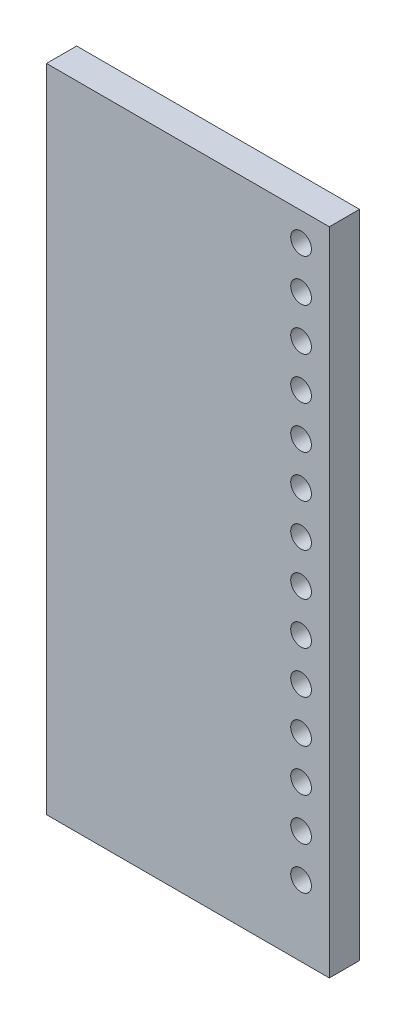
ISO-10303-21;
HEADER;
FILE_DESCRIPTION(('STEP AP214'),'2;1');
FILE_NAME('part.step','',(''),(''),'','','');
FILE_SCHEMA(('AUTOMOTIVE_DESIGN { 1 0 10303 214 1 1 1 1 }'));
ENDSEC;
DATA;
#1=APPLICATION_CONTEXT('core data for automotive mechanical design processes');
#2=APPLICATION_PROTOCOL_DEFINITION('international standard','automotive_design',2000,#1);
#3=PRODUCT_CONTEXT('',#1,'mechanical');
#4=PRODUCT('Part','Part','',(#3));
#5=PRODUCT_RELATED_PRODUCT_CATEGORY('part','',(#4));
#6=PRODUCT_DEFINITION_FORMATION('','',#4);
#7=PRODUCT_DEFINITION_CONTEXT('part definition',#1,'design');
#8=PRODUCT_DEFINITION('design','',#6,#7);
#9=PRODUCT_DEFINITION_SHAPE('','',#8);
#10=(LENGTH_UNIT() NAMED_UNIT(*) SI_UNIT(.MILLI.,.METRE.));
#11=(NAMED_UNIT(*) PLANE_ANGLE_UNIT() SI_UNIT($,.RADIAN.));
#12=(NAMED_UNIT(*) SI_UNIT($,.STERADIAN.) SOLID_ANGLE_UNIT());
#13=UNCERTAINTY_MEASURE_WITH_UNIT(LENGTH_MEASURE(1.E-05),#10,'distance_accuracy_value','');
#14=(GEOMETRIC_REPRESENTATION_CONTEXT(3) GLOBAL_UNCERTAINTY_ASSIGNED_CONTEXT((#13)) GLOBAL_UNIT_ASSIGNED_CONTEXT((#10,
#11,#12)) REPRESENTATION_CONTEXT('',''));
#15=CARTESIAN_POINT('',(0.,0.,0.));
#16=DIRECTION('',(0.,0.,1.));
#17=DIRECTION('',(1.,0.,0.));
#18=AXIS2_PLACEMENT_3D('',#15,#16,#17);
#19=CARTESIAN_POINT('',(60.,330.,0.));
#20=DIRECTION('',(0.,0.,1.));
#21=DIRECTION('',(1.,0.,0.));
#22=AXIS2_PLACEMENT_3D('',#19,#20,#21);
#23=CYLINDRICAL_SURFACE('',#22,5.5);
#24=CARTESIAN_POINT('',(60.,330.,0.));
#25=DIRECTION('',(0.,0.,1.));
#26=DIRECTION('',(1.,0.,0.));
#27=AXIS2_PLACEMENT_3D('',#24,#25,#26);
#28=CIRCLE('',#27,5.5);
#29=CARTESIAN_POINT('',(65.5,330.,0.));
#30=VERTEX_POINT('',#29);
#31=EDGE_CURVE('E55',#30,#30,#28,.T.);
#32=ORIENTED_EDGE('',*,*,#31,.F.);
#33=EDGE_LOOP('',(#32));
#34=FACE_BOUND('',#33,.T.);
#35=CARTESIAN_POINT('',(60.,330.,16.));
#36=DIRECTION('',(0.,0.,1.));
#37=DIRECTION('',(1.,0.,0.));
#38=AXIS2_PLACEMENT_3D('',#35,#36,#37);
#39=CIRCLE('',#38,5.5);
#40=CARTESIAN_POINT('',(65.5,330.,16.));
#41=VERTEX_POINT('',#40);
#42=EDGE_CURVE('E11',#41,#41,#39,.T.);
#43=ORIENTED_EDGE('',*,*,#42,.T.);
#44=EDGE_LOOP('',(#43));
#45=FACE_BOUND('',#44,.T.);
#46=ADVANCED_FACE('F47',(#34,#45),#23,.F.);
#47=CARTESIAN_POINT('',(60.,307.5,0.));
#48=DIRECTION('',(0.,0.,1.));
#49=DIRECTION('',(1.,0.,0.));
#50=AXIS2_PLACEMENT_3D('',#47,#48,#49);
#51=CYLINDRICAL_SURFACE('',#50,5.5);
#52=CARTESIAN_POINT('',(60.,307.5,0.));
#53=DIRECTION('',(0.,0.,1.));
#54=DIRECTION('',(1.,0.,0.));
#55=AXIS2_PLACEMENT_3D('',#52,#53,#54);
#56=CIRCLE('',#55,5.5);
#57=CARTESIAN_POINT('',(65.5,307.5,0.));
#58=VERTEX_POINT('',#57);
#59=EDGE_CURVE('E225',#58,#58,#56,.T.);
#60=ORIENTED_EDGE('',*,*,#59,.F.);
#61=EDGE_LOOP('',(#60));
#62=FACE_BOUND('',#61,.T.);
#63=CARTESIAN_POINT('',(60.,307.5,16.));
#64=DIRECTION('',(0.,0.,1.));
#65=DIRECTION('',(1.,0.,0.));
#66=AXIS2_PLACEMENT_3D('',#63,#64,#65);
#67=CIRCLE('',#66,5.5);
#68=CARTESIAN_POINT('',(65.5,307.5,16.));
#69=VERTEX_POINT('',#68);
#70=EDGE_CURVE('E228',#69,#69,#67,.T.);
#71=ORIENTED_EDGE('',*,*,#70,.T.);
#72=EDGE_LOOP('',(#71));
#73=FACE_BOUND('',#72,.T.);
#74=ADVANCED_FACE('F237',(#62,#73),#51,.F.);
#75=CARTESIAN_POINT('',(60.,285.,0.));
#76=DIRECTION('',(0.,0.,1.));
#77=DIRECTION('',(1.,0.,0.));
#78=AXIS2_PLACEMENT_3D('',#75,#76,#77);
#79=CYLINDRICAL_SURFACE('',#78,5.5);
#80=CARTESIAN_POINT('',(60.,285.,0.));
#81=DIRECTION('',(0.,0.,1.));
#82=DIRECTION('',(1.,0.,0.));
#83=AXIS2_PLACEMENT_3D('',#80,#81,#82);
#84=CIRCLE('',#83,5.5);
#85=CARTESIAN_POINT('',(65.5,285.,0.));
#86=VERTEX_POINT('',#85);
#87=EDGE_CURVE('E219',#86,#86,#84,.T.);
#88=ORIENTED_EDGE('',*,*,#87,.F.);
#89=EDGE_LOOP('',(#88));
#90=FACE_BOUND('',#89,.T.);
#91=CARTESIAN_POINT('',(60.,285.,16.));
#92=DIRECTION('',(0.,0.,1.));
#93=DIRECTION('',(1.,0.,0.));
#94=AXIS2_PLACEMENT_3D('',#91,#92,#93);
#95=CIRCLE('',#94,5.5);
#96=CARTESIAN_POINT('',(65.5,285.,16.));
#97=VERTEX_POINT('',#96);
#98=EDGE_CURVE('E222',#97,#97,#95,.T.);
#99=ORIENTED_EDGE('',*,*,#98,.T.);
#100=EDGE_LOOP('',(#99));
#101=FACE_BOUND('',#100,.T.);
#102=ADVANCED_FACE('F304',(#90,#101),#79,.F.);
#103=CARTESIAN_POINT('',(60.,262.5,0.));
#104=DIRECTION('',(0.,0.,1.));
#105=DIRECTION('',(1.,0.,0.));
#106=AXIS2_PLACEMENT_3D('',#103,#104,#105);
#107=CYLINDRICAL_SURFACE('',#106,5.5);
#108=CARTESIAN_POINT('',(60.,262.5,0.));
#109=DIRECTION('',(0.,0.,1.));
#110=DIRECTION('',(1.,0.,0.));
#111=AXIS2_PLACEMENT_3D('',#108,#109,#110);
#112=CIRCLE('',#111,5.5);
#113=CARTESIAN_POINT('',(65.5,262.5,0.));
#114=VERTEX_POINT('',#113);
#115=EDGE_CURVE('E213',#114,#114,#112,.T.);
#116=ORIENTED_EDGE('',*,*,#115,.F.);
#117=EDGE_LOOP('',(#116));
#118=FACE_BOUND('',#117,.T.);
#119=CARTESIAN_POINT('',(60.,262.5,16.));
#120=DIRECTION('',(0.,0.,1.));
#121=DIRECTION('',(1.,0.,0.));
#122=AXIS2_PLACEMENT_3D('',#119,#120,#121);
#123=CIRCLE('',#122,5.5);
#124=CARTESIAN_POINT('',(65.5,262.5,16.));
#125=VERTEX_POINT('',#124);
#126=EDGE_CURVE('E216',#125,#125,#123,.T.);
#127=ORIENTED_EDGE('',*,*,#126,.T.);
#128=EDGE_LOOP('',(#127));
#129=FACE_BOUND('',#128,.T.);
#130=ADVANCED_FACE('F300',(#118,#129),#107,.F.);
#131=CARTESIAN_POINT('',(60.,240.,0.));
#132=DIRECTION('',(0.,0.,1.));
#133=DIRECTION('',(1.,0.,0.));
#134=AXIS2_PLACEMENT_3D('',#131,#132,#133);
#135=CYLINDRICAL_SURFACE('',#134,5.5);
#136=CARTESIAN_POINT('',(60.,240.,0.));
#137=DIRECTION('',(0.,0.,1.));
#138=DIRECTION('',(1.,0.,0.));
#139=AXIS2_PLACEMENT_3D('',#136,#137,#138);
#140=CIRCLE('',#139,5.5);
#141=CARTESIAN_POINT('',(65.5,240.,0.));
#142=VERTEX_POINT('',#141);
#143=EDGE_CURVE('E207',#142,#142,#140,.T.);
#144=ORIENTED_EDGE('',*,*,#143,.F.);
#145=EDGE_LOOP('',(#144));
#146=FACE_BOUND('',#145,.T.);
#147=CARTESIAN_POINT('',(60.,240.,16.));
#148=DIRECTION('',(0.,0.,1.));
#149=DIRECTION('',(1.,0.,0.));
#150=AXIS2_PLACEMENT_3D('',#147,#148,#149);
#151=CIRCLE('',#150,5.5);
#152=CARTESIAN_POINT('',(65.5,240.,16.));
#153=VERTEX_POINT('',#152);
#154=EDGE_CURVE('E210',#153,#153,#151,.T.);
#155=ORIENTED_EDGE('',*,*,#154,.T.);
#156=EDGE_LOOP('',(#155));
#157=FACE_BOUND('',#156,.T.);
#158=ADVANCED_FACE('F296',(#146,#157),#135,.F.);
#159=CARTESIAN_POINT('',(60.,217.5,0.));
#160=DIRECTION('',(0.,0.,1.));
#161=DIRECTION('',(1.,0.,0.));
#162=AXIS2_PLACEMENT_3D('',#159,#160,#161);
#163=CYLINDRICAL_SURFACE('',#162,5.5);
#164=CARTESIAN_POINT('',(60.,217.5,0.));
#165=DIRECTION('',(0.,0.,1.));
#166=DIRECTION('',(1.,0.,0.));
#167=AXIS2_PLACEMENT_3D('',#164,#165,#166);
#168=CIRCLE('',#167,5.5);
#169=CARTESIAN_POINT('',(65.5,217.5,0.));
#170=VERTEX_POINT('',#169);
#171=EDGE_CURVE('E201',#170,#170,#168,.T.);
#172=ORIENTED_EDGE('',*,*,#171,.F.);
#173=EDGE_LOOP('',(#172));
#174=FACE_BOUND('',#173,.T.);
#175=CARTESIAN_POINT('',(60.,217.5,16.));
#176=DIRECTION('',(0.,0.,1.));
#177=DIRECTION('',(1.,0.,0.));
#178=AXIS2_PLACEMENT_3D('',#175,#176,#177);
#179=CIRCLE('',#178,5.5);
#180=CARTESIAN_POINT('',(65.5,217.5,16.));
#181=VERTEX_POINT('',#180);
#182=EDGE_CURVE('E204',#181,#181,#179,.T.);
#183=ORIENTED_EDGE('',*,*,#182,.T.);
#184=EDGE_LOOP('',(#183));
#185=FACE_BOUND('',#184,.T.);
#186=ADVANCED_FACE('F292',(#174,#185),#163,.F.);
#187=CARTESIAN_POINT('',(60.,195.,0.));
#188=DIRECTION('',(0.,0.,1.));
#189=DIRECTION('',(1.,0.,0.));
#190=AXIS2_PLACEMENT_3D('',#187,#188,#189);
#191=CYLINDRICAL_SURFACE('',#190,5.5);
#192=CARTESIAN_POINT('',(60.,195.,0.));
#193=DIRECTION('',(0.,0.,1.));
#194=DIRECTION('',(1.,0.,0.));
#195=AXIS2_PLACEMENT_3D('',#192,#193,#194);
#196=CIRCLE('',#195,5.5);
#197=CARTESIAN_POINT('',(65.5,195.,0.));
#198=VERTEX_POINT('',#197);
#199=EDGE_CURVE('E195',#198,#198,#196,.T.);
#200=ORIENTED_EDGE('',*,*,#199,.F.);
#201=EDGE_LOOP('',(#200));
#202=FACE_BOUND('',#201,.T.);
#203=CARTESIAN_POINT('',(60.,195.,16.));
#204=DIRECTION('',(0.,0.,1.));
#205=DIRECTION('',(1.,0.,0.));
#206=AXIS2_PLACEMENT_3D('',#203,#204,#205);
#207=CIRCLE('',#206,5.5);
#208=CARTESIAN_POINT('',(65.5,195.,16.));
#209=VERTEX_POINT('',#208);
#210=EDGE_CURVE('E198',#209,#209,#207,.T.);
#211=ORIENTED_EDGE('',*,*,#210,.T.);
#212=EDGE_LOOP('',(#211));
#213=FACE_BOUND('',#212,.T.);
#214=ADVANCED_FACE('F288',(#202,#213),#191,.F.);
#215=CARTESIAN_POINT('',(60.,172.5,0.));
#216=DIRECTION('',(0.,0.,1.));
#217=DIRECTION('',(1.,0.,0.));
#218=AXIS2_PLACEMENT_3D('',#215,#216,#217);
#219=CYLINDRICAL_SURFACE('',#218,5.5);
#220=CARTESIAN_POINT('',(60.,172.5,0.));
#221=DIRECTION('',(0.,0.,1.));
#222=DIRECTION('',(1.,0.,0.));
#223=AXIS2_PLACEMENT_3D('',#220,#221,#222);
#224=CIRCLE('',#223,5.5);
#225=CARTESIAN_POINT('',(65.5,172.5,0.));
#226=VERTEX_POINT('',#225);
#227=EDGE_CURVE('E189',#226,#226,#224,.T.);
#228=ORIENTED_EDGE('',*,*,#227,.F.);
#229=EDGE_LOOP('',(#228));
#230=FACE_BOUND('',#229,.T.);
#231=CARTESIAN_POINT('',(60.,172.5,16.));
#232=DIRECTION('',(0.,0.,1.));
#233=DIRECTION('',(1.,0.,0.));
#234=AXIS2_PLACEMENT_3D('',#231,#232,#233);
#235=CIRCLE('',#234,5.5);
#236=CARTESIAN_POINT('',(65.5,172.5,16.));
#237=VERTEX_POINT('',#236);
#238=EDGE_CURVE('E192',#237,#237,#235,.T.);
#239=ORIENTED_EDGE('',*,*,#238,.T.);
#240=EDGE_LOOP('',(#239));
#241=FACE_BOUND('',#240,.T.);
#242=ADVANCED_FACE('F284',(#230,#241),#219,.F.);
#243=CARTESIAN_POINT('',(60.,150.,0.));
#244=DIRECTION('',(0.,0.,1.));
#245=DIRECTION('',(1.,0.,0.));
#246=AXIS2_PLACEMENT_3D('',#243,#244,#245);
#247=CYLINDRICAL_SURFACE('',#246,5.5);
#248=CARTESIAN_POINT('',(60.,150.,0.));
#249=DIRECTION('',(0.,0.,1.));
#250=DIRECTION('',(1.,0.,0.));
#251=AXIS2_PLACEMENT_3D('',#248,#249,#250);
#252=CIRCLE('',#251,5.5);
#253=CARTESIAN_POINT('',(65.5,150.,0.));
#254=VERTEX_POINT('',#253);
#255=EDGE_CURVE('E183',#254,#254,#252,.T.);
#256=ORIENTED_EDGE('',*,*,#255,.F.);
#257=EDGE_LOOP('',(#256));
#258=FACE_BOUND('',#257,.T.);
#259=CARTESIAN_POINT('',(60.,150.,16.));
#260=DIRECTION('',(0.,0.,1.));
#261=DIRECTION('',(1.,0.,0.));
#262=AXIS2_PLACEMENT_3D('',#259,#260,#261);
#263=CIRCLE('',#262,5.5);
#264=CARTESIAN_POINT('',(65.5,150.,16.));
#265=VERTEX_POINT('',#264);
#266=EDGE_CURVE('E186',#265,#265,#263,.T.);
#267=ORIENTED_EDGE('',*,*,#266,.T.);
#268=EDGE_LOOP('',(#267));
#269=FACE_BOUND('',#268,.T.);
#270=ADVANCED_FACE('F280',(#258,#269),#247,.F.);
#271=CARTESIAN_POINT('',(60.,127.5,0.));
#272=DIRECTION('',(0.,0.,1.));
#273=DIRECTION('',(1.,0.,0.));
#274=AXIS2_PLACEMENT_3D('',#271,#272,#273);
#275=CYLINDRICAL_SURFACE('',#274,5.5);
#276=CARTESIAN_POINT('',(60.,127.5,0.));
#277=DIRECTION('',(0.,0.,1.));
#278=DIRECTION('',(1.,0.,0.));
#279=AXIS2_PLACEMENT_3D('',#276,#277,#278);
#280=CIRCLE('',#279,5.5);
#281=CARTESIAN_POINT('',(65.5,127.5,0.));
#282=VERTEX_POINT('',#281);
#283=EDGE_CURVE('E177',#282,#282,#280,.T.);
#284=ORIENTED_EDGE('',*,*,#283,.F.);
#285=EDGE_LOOP('',(#284));
#286=FACE_BOUND('',#285,.T.);
#287=CARTESIAN_POINT('',(60.,127.5,16.));
#288=DIRECTION('',(0.,0.,1.));
#289=DIRECTION('',(1.,0.,0.));
#290=AXIS2_PLACEMENT_3D('',#287,#288,#289);
#291=CIRCLE('',#290,5.5);
#292=CARTESIAN_POINT('',(65.5,127.5,16.));
#293=VERTEX_POINT('',#292);
#294=EDGE_CURVE('E180',#293,#293,#291,.T.);
#295=ORIENTED_EDGE('',*,*,#294,.T.);
#296=EDGE_LOOP('',(#295));
#297=FACE_BOUND('',#296,.T.);
#298=ADVANCED_FACE('F276',(#286,#297),#275,.F.);
#299=CARTESIAN_POINT('',(60.,105.,0.));
#300=DIRECTION('',(0.,0.,1.));
#301=DIRECTION('',(1.,0.,0.));
#302=AXIS2_PLACEMENT_3D('',#299,#300,#301);
#303=CYLINDRICAL_SURFACE('',#302,5.5);
#304=CARTESIAN_POINT('',(60.,105.,0.));
#305=DIRECTION('',(0.,0.,1.));
#306=DIRECTION('',(1.,0.,0.));
#307=AXIS2_PLACEMENT_3D('',#304,#305,#306);
#308=CIRCLE('',#307,5.5);
#309=CARTESIAN_POINT('',(65.5,105.,0.));
#310=VERTEX_POINT('',#309);
#311=EDGE_CURVE('E171',#310,#310,#308,.T.);
#312=ORIENTED_EDGE('',*,*,#311,.F.);
#313=EDGE_LOOP('',(#312));
#314=FACE_BOUND('',#313,.T.);
#315=CARTESIAN_POINT('',(60.,105.,16.));
#316=DIRECTION('',(0.,0.,1.));
#317=DIRECTION('',(1.,0.,0.));
#318=AXIS2_PLACEMENT_3D('',#315,#316,#317);
#319=CIRCLE('',#318,5.5);
#320=CARTESIAN_POINT('',(65.5,105.,16.));
#321=VERTEX_POINT('',#320);
#322=EDGE_CURVE('E174',#321,#321,#319,.T.);
#323=ORIENTED_EDGE('',*,*,#322,.T.);
#324=EDGE_LOOP('',(#323));
#325=FACE_BOUND('',#324,.T.);
#326=ADVANCED_FACE('F272',(#314,#325),#303,.F.);
#327=CARTESIAN_POINT('',(60.,82.5,0.));
#328=DIRECTION('',(0.,0.,1.));
#329=DIRECTION('',(1.,0.,0.));
#330=AXIS2_PLACEMENT_3D('',#327,#328,#329);
#331=CYLINDRICAL_SURFACE('',#330,5.5);
#332=CARTESIAN_POINT('',(60.,82.5,0.));
#333=DIRECTION('',(0.,0.,1.));
#334=DIRECTION('',(1.,0.,0.));
#335=AXIS2_PLACEMENT_3D('',#332,#333,#334);
#336=CIRCLE('',#335,5.5);
#337=CARTESIAN_POINT('',(65.5,82.5,0.));
#338=VERTEX_POINT('',#337);
#339=EDGE_CURVE('E165',#338,#338,#336,.T.);
#340=ORIENTED_EDGE('',*,*,#339,.F.);
#341=EDGE_LOOP('',(#340));
#342=FACE_BOUND('',#341,.T.);
#343=CARTESIAN_POINT('',(60.,82.5,16.));
#344=DIRECTION('',(0.,0.,1.));
#345=DIRECTION('',(1.,0.,0.));
#346=AXIS2_PLACEMENT_3D('',#343,#344,#345);
#347=CIRCLE('',#346,5.5);
#348=CARTESIAN_POINT('',(65.5,82.5,16.));
#349=VERTEX_POINT('',#348);
#350=EDGE_CURVE('E168',#349,#349,#347,.T.);
#351=ORIENTED_EDGE('',*,*,#350,.T.);
#352=EDGE_LOOP('',(#351));
#353=FACE_BOUND('',#352,.T.);
#354=ADVANCED_FACE('F269',(#342,#353),#331,.F.);
#355=CARTESIAN_POINT('',(-75.,0.,16.));
#356=DIRECTION('',(1.,0.,0.));
#357=DIRECTION('',(0.,1.,0.));
#358=AXIS2_PLACEMENT_3D('',#355,#356,#357);
#359=PLANE('',#358);
#360=DIRECTION('',(0.,-1.,0.));
#361=VECTOR('',#360,1.);
#362=CARTESIAN_POINT('',(-75.,0.,0.));
#363=LINE('',#362,#361);
#364=CARTESIAN_POINT('',(-75.0000000000001,345.,0.));
#365=VERTEX_POINT('',#364);
#366=CARTESIAN_POINT('',(-75.,0.,0.));
#367=VERTEX_POINT('',#366);
#368=EDGE_CURVE('E142',#365,#367,#363,.T.);
#369=ORIENTED_EDGE('',*,*,#368,.T.);
#370=DIRECTION('',(0.,0.,-1.));
#371=VECTOR('',#370,1.);
#372=CARTESIAN_POINT('',(-75.,0.,16.));
#373=LINE('',#372,#371);
#374=CARTESIAN_POINT('',(-75.,0.,16.));
#375=VERTEX_POINT('',#374);
#376=EDGE_CURVE('E163',#375,#367,#373,.T.);
#377=ORIENTED_EDGE('',*,*,#376,.F.);
#378=DIRECTION('',(0.,-1.,0.));
#379=VECTOR('',#378,1.);
#380=CARTESIAN_POINT('',(-75.,0.,16.));
#381=LINE('',#380,#379);
#382=CARTESIAN_POINT('',(-75.0000000000001,345.,16.));
#383=VERTEX_POINT('',#382);
#384=EDGE_CURVE('E145',#383,#375,#381,.T.);
#385=ORIENTED_EDGE('',*,*,#384,.F.);
#386=DIRECTION('',(0.,0.,-1.));
#387=VECTOR('',#386,1.);
#388=CARTESIAN_POINT('',(-75.0000000000001,345.,16.));
#389=LINE('',#388,#387);
#390=EDGE_CURVE('E151',#383,#365,#389,.T.);
#391=ORIENTED_EDGE('',*,*,#390,.T.);
#392=EDGE_LOOP('',(#369,#377,#385,#391));
#393=FACE_BOUND('',#392,.T.);
#394=ADVANCED_FACE('F265',(#393),#359,.F.);
#395=CARTESIAN_POINT('',(-75.,0.,16.));
#396=DIRECTION('',(0.,1.,0.));
#397=DIRECTION('',(-1.,0.,0.));
#398=AXIS2_PLACEMENT_3D('',#395,#396,#397);
#399=PLANE('',#398);
#400=CARTESIAN_POINT('',(60.,0.,8.));
#401=DIRECTION('',(0.,-1.,0.));
#402=DIRECTION('',(0.,0.,-1.));
#403=AXIS2_PLACEMENT_3D('',#400,#401,#402);
#404=CIRCLE('',#403,1.7272);
#405=CARTESIAN_POINT('',(60.,0.,6.2728));
#406=VERTEX_POINT('',#405);
#407=EDGE_CURVE('E116',#406,#406,#404,.T.);
#408=ORIENTED_EDGE('',*,*,#407,.F.);
#409=EDGE_LOOP('',(#408));
#410=FACE_BOUND('',#409,.T.);
#411=CARTESIAN_POINT('',(0.,0.,8.));
#412=DIRECTION('',(0.,-1.,0.));
#413=DIRECTION('',(0.,0.,-1.));
#414=AXIS2_PLACEMENT_3D('',#411,#412,#413);
#415=CIRCLE('',#414,1.7272);
#416=CARTESIAN_POINT('',(0.,0.,6.2728));
#417=VERTEX_POINT('',#416);
#418=EDGE_CURVE('E115',#417,#417,#415,.T.);
#419=ORIENTED_EDGE('',*,*,#418,.F.);
#420=EDGE_LOOP('',(#419));
#421=FACE_BOUND('',#420,.T.);
#422=CARTESIAN_POINT('',(-60.,0.,8.));
#423=DIRECTION('',(0.,-1.,0.));
#424=DIRECTION('',(0.,0.,-1.));
#425=AXIS2_PLACEMENT_3D('',#422,#423,#424);
#426=CIRCLE('',#425,1.7272);
#427=CARTESIAN_POINT('',(-60.,0.,6.2728));
#428=VERTEX_POINT('',#427);
#429=EDGE_CURVE('E126',#428,#428,#426,.T.);
#430=ORIENTED_EDGE('',*,*,#429,.F.);
#431=EDGE_LOOP('',(#430));
#432=FACE_BOUND('',#431,.T.);
#433=DIRECTION('',(1.,0.,0.));
#434=VECTOR('',#433,1.);
#435=CARTESIAN_POINT('',(-75.,0.,0.));
#436=LINE('',#435,#434);
#437=CARTESIAN_POINT('',(75.,0.,0.));
#438=VERTEX_POINT('',#437);
#439=EDGE_CURVE('E154',#367,#438,#436,.T.);
#440=ORIENTED_EDGE('',*,*,#439,.T.);
#441=DIRECTION('',(0.,0.,-1.));
#442=VECTOR('',#441,1.);
#443=CARTESIAN_POINT('',(75.,0.,16.));
#444=LINE('',#443,#442);
#445=CARTESIAN_POINT('',(75.,0.,16.));
#446=VERTEX_POINT('',#445);
#447=EDGE_CURVE('E161',#446,#438,#444,.T.);
#448=ORIENTED_EDGE('',*,*,#447,.F.);
#449=DIRECTION('',(1.,0.,0.));
#450=VECTOR('',#449,1.);
#451=CARTESIAN_POINT('',(-75.,0.,16.));
#452=LINE('',#451,#450);
#453=EDGE_CURVE('E95',#375,#446,#452,.T.);
#454=ORIENTED_EDGE('',*,*,#453,.F.);
#455=ORIENTED_EDGE('',*,*,#376,.T.);
#456=EDGE_LOOP('',(#440,#448,#454,#455));
#457=FACE_BOUND('',#456,.T.);
#458=ADVANCED_FACE('F262',(#410,#421,#432,#457),#399,.F.);
#459=CARTESIAN_POINT('',(75.,0.,16.));
#460=DIRECTION('',(-1.,0.,0.));
#461=DIRECTION('',(0.,-1.,0.));
#462=AXIS2_PLACEMENT_3D('',#459,#460,#461);
#463=PLANE('',#462);
#464=DIRECTION('',(0.,1.,0.));
#465=VECTOR('',#464,1.);
#466=CARTESIAN_POINT('',(75.,0.,0.));
#467=LINE('',#466,#465);
#468=CARTESIAN_POINT('',(75.,345.,0.));
#469=VERTEX_POINT('',#468);
#470=EDGE_CURVE('E81',#438,#469,#467,.T.);
#471=ORIENTED_EDGE('',*,*,#470,.T.);
#472=DIRECTION('',(0.,0.,-1.));
#473=VECTOR('',#472,1.);
#474=CARTESIAN_POINT('',(75.,345.,16.));
#475=LINE('',#474,#473);
#476=CARTESIAN_POINT('',(75.,345.,16.));
#477=VERTEX_POINT('',#476);
#478=EDGE_CURVE('E159',#477,#469,#475,.T.);
#479=ORIENTED_EDGE('',*,*,#478,.F.);
#480=DIRECTION('',(0.,1.,0.));
#481=VECTOR('',#480,1.);
#482=CARTESIAN_POINT('',(75.,0.,16.));
#483=LINE('',#482,#481);
#484=EDGE_CURVE('E148',#446,#477,#483,.T.);
#485=ORIENTED_EDGE('',*,*,#484,.F.);
#486=ORIENTED_EDGE('',*,*,#447,.T.);
#487=EDGE_LOOP('',(#471,#479,#485,#486));
#488=FACE_BOUND('',#487,.T.);
#489=ADVANCED_FACE('F253',(#488),#463,.F.);
#490=CARTESIAN_POINT('',(-75.0000000000001,345.,16.));
#491=DIRECTION('',(0.,-1.,0.));
#492=DIRECTION('',(0.,0.,-1.));
#493=AXIS2_PLACEMENT_3D('',#490,#491,#492);
#494=PLANE('',#493);
#495=DIRECTION('',(-1.,0.,0.));
#496=VECTOR('',#495,1.);
#497=CARTESIAN_POINT('',(-75.0000000000001,345.,0.));
#498=LINE('',#497,#496);
#499=EDGE_CURVE('E87',#469,#365,#498,.T.);
#500=ORIENTED_EDGE('',*,*,#499,.T.);
#501=ORIENTED_EDGE('',*,*,#390,.F.);
#502=DIRECTION('',(-1.,0.,0.));
#503=VECTOR('',#502,1.);
#504=CARTESIAN_POINT('',(-75.0000000000001,345.,16.));
#505=LINE('',#504,#503);
#506=EDGE_CURVE('E63',#477,#383,#505,.T.);
#507=ORIENTED_EDGE('',*,*,#506,.F.);
#508=ORIENTED_EDGE('',*,*,#478,.T.);
#509=EDGE_LOOP('',(#500,#501,#507,#508));
#510=FACE_BOUND('',#509,.T.);
#511=ADVANCED_FACE('F242',(#510),#494,.F.);
#512=CARTESIAN_POINT('',(0.,0.,16.));
#513=DIRECTION('',(0.,0.,-1.));
#514=DIRECTION('',(-1.,0.,0.));
#515=AXIS2_PLACEMENT_3D('',#512,#513,#514);
#516=PLANE('',#515);
#517=CARTESIAN_POINT('',(60.,60.,16.));
#518=DIRECTION('',(0.,0.,1.));
#519=DIRECTION('',(1.,0.,0.));
#520=AXIS2_PLACEMENT_3D('',#517,#518,#519);
#521=CIRCLE('',#520,5.5);
#522=CARTESIAN_POINT('',(65.5,60.,16.));
#523=VERTEX_POINT('',#522);
#524=EDGE_CURVE('E135',#523,#523,#521,.T.);
#525=ORIENTED_EDGE('',*,*,#524,.F.);
#526=EDGE_LOOP('',(#525));
#527=FACE_BOUND('',#526,.T.);
#528=CARTESIAN_POINT('',(60.,37.5,16.));
#529=DIRECTION('',(0.,0.,1.));
#530=DIRECTION('',(1.,0.,0.));
#531=AXIS2_PLACEMENT_3D('',#528,#529,#530);
#532=CIRCLE('',#531,5.5);
#533=CARTESIAN_POINT('',(65.5,37.5,16.));
#534=VERTEX_POINT('',#533);
#535=EDGE_CURVE('E138',#534,#534,#532,.T.);
#536=ORIENTED_EDGE('',*,*,#535,.F.);
#537=EDGE_LOOP('',(#536));
#538=FACE_BOUND('',#537,.T.);
#539=ORIENTED_EDGE('',*,*,#384,.T.);
#540=ORIENTED_EDGE('',*,*,#453,.T.);
#541=ORIENTED_EDGE('',*,*,#484,.T.);
#542=ORIENTED_EDGE('',*,*,#506,.T.);
#543=EDGE_LOOP('',(#539,#540,#541,#542));
#544=FACE_BOUND('',#543,.T.);
#545=ORIENTED_EDGE('',*,*,#350,.F.);
#546=EDGE_LOOP('',(#545));
#547=FACE_BOUND('',#546,.T.);
#548=ORIENTED_EDGE('',*,*,#322,.F.);
#549=EDGE_LOOP('',(#548));
#550=FACE_BOUND('',#549,.T.);
#551=ORIENTED_EDGE('',*,*,#294,.F.);
#552=EDGE_LOOP('',(#551));
#553=FACE_BOUND('',#552,.T.);
#554=ORIENTED_EDGE('',*,*,#266,.F.);
#555=EDGE_LOOP('',(#554));
#556=FACE_BOUND('',#555,.T.);
#557=ORIENTED_EDGE('',*,*,#238,.F.);
#558=EDGE_LOOP('',(#557));
#559=FACE_BOUND('',#558,.T.);
#560=ORIENTED_EDGE('',*,*,#210,.F.);
#561=EDGE_LOOP('',(#560));
#562=FACE_BOUND('',#561,.T.);
#563=ORIENTED_EDGE('',*,*,#182,.F.);
#564=EDGE_LOOP('',(#563));
#565=FACE_BOUND('',#564,.T.);
#566=ORIENTED_EDGE('',*,*,#154,.F.);
#567=EDGE_LOOP('',(#566));
#568=FACE_BOUND('',#567,.T.);
#569=ORIENTED_EDGE('',*,*,#126,.F.);
#570=EDGE_LOOP('',(#569));
#571=FACE_BOUND('',#570,.T.);
#572=ORIENTED_EDGE('',*,*,#98,.F.);
#573=EDGE_LOOP('',(#572));
#574=FACE_BOUND('',#573,.T.);
#575=ORIENTED_EDGE('',*,*,#70,.F.);
#576=EDGE_LOOP('',(#575));
#577=FACE_BOUND('',#576,.T.);
#578=ORIENTED_EDGE('',*,*,#42,.F.);
#579=EDGE_LOOP('',(#578));
#580=FACE_BOUND('',#579,.T.);
#581=ADVANCED_FACE('F240',(#527,#538,#544,#547,#550,#553,#556,#559,#562,#565,#568,#571,#574,
#577,#580),#516,.F.);
#582=CARTESIAN_POINT('',(0.,0.,0.));
#583=DIRECTION('',(0.,0.,-1.));
#584=DIRECTION('',(-1.,0.,0.));
#585=AXIS2_PLACEMENT_3D('',#582,#583,#584);
#586=PLANE('',#585);
#587=CARTESIAN_POINT('',(60.,60.,0.));
#588=DIRECTION('',(0.,0.,1.));
#589=DIRECTION('',(1.,0.,0.));
#590=AXIS2_PLACEMENT_3D('',#587,#588,#589);
#591=CIRCLE('',#590,5.5);
#592=CARTESIAN_POINT('',(65.5,60.,0.));
#593=VERTEX_POINT('',#592);
#594=EDGE_CURVE('E132',#593,#593,#591,.T.);
#595=ORIENTED_EDGE('',*,*,#594,.T.);
#596=EDGE_LOOP('',(#595));
#597=FACE_BOUND('',#596,.T.);
#598=CARTESIAN_POINT('',(60.,37.5,0.));
#599=DIRECTION('',(0.,0.,1.));
#600=DIRECTION('',(1.,0.,0.));
#601=AXIS2_PLACEMENT_3D('',#598,#599,#600);
#602=CIRCLE('',#601,5.5);
#603=CARTESIAN_POINT('',(65.5,37.5,0.));
#604=VERTEX_POINT('',#603);
#605=EDGE_CURVE('E139',#604,#604,#602,.T.);
#606=ORIENTED_EDGE('',*,*,#605,.T.);
#607=EDGE_LOOP('',(#606));
#608=FACE_BOUND('',#607,.T.);
#609=ORIENTED_EDGE('',*,*,#368,.F.);
#610=ORIENTED_EDGE('',*,*,#499,.F.);
#611=ORIENTED_EDGE('',*,*,#470,.F.);
#612=ORIENTED_EDGE('',*,*,#439,.F.);
#613=EDGE_LOOP('',(#609,#610,#611,#612));
#614=FACE_BOUND('',#613,.T.);
#615=ORIENTED_EDGE('',*,*,#339,.T.);
#616=EDGE_LOOP('',(#615));
#617=FACE_BOUND('',#616,.T.);
#618=ORIENTED_EDGE('',*,*,#311,.T.);
#619=EDGE_LOOP('',(#618));
#620=FACE_BOUND('',#619,.T.);
#621=ORIENTED_EDGE('',*,*,#283,.T.);
#622=EDGE_LOOP('',(#621));
#623=FACE_BOUND('',#622,.T.);
#624=ORIENTED_EDGE('',*,*,#255,.T.);
#625=EDGE_LOOP('',(#624));
#626=FACE_BOUND('',#625,.T.);
#627=ORIENTED_EDGE('',*,*,#227,.T.);
#628=EDGE_LOOP('',(#627));
#629=FACE_BOUND('',#628,.T.);
#630=ORIENTED_EDGE('',*,*,#199,.T.);
#631=EDGE_LOOP('',(#630));
#632=FACE_BOUND('',#631,.T.);
#633=ORIENTED_EDGE('',*,*,#171,.T.);
#634=EDGE_LOOP('',(#633));
#635=FACE_BOUND('',#634,.T.);
#636=ORIENTED_EDGE('',*,*,#143,.T.);
#637=EDGE_LOOP('',(#636));
#638=FACE_BOUND('',#637,.T.);
#639=ORIENTED_EDGE('',*,*,#115,.T.);
#640=EDGE_LOOP('',(#639));
#641=FACE_BOUND('',#640,.T.);
#642=ORIENTED_EDGE('',*,*,#87,.T.);
#643=EDGE_LOOP('',(#642));
#644=FACE_BOUND('',#643,.T.);
#645=ORIENTED_EDGE('',*,*,#59,.T.);
#646=EDGE_LOOP('',(#645));
#647=FACE_BOUND('',#646,.T.);
#648=ORIENTED_EDGE('',*,*,#31,.T.);
#649=EDGE_LOOP('',(#648));
#650=FACE_BOUND('',#649,.T.);
#651=ADVANCED_FACE('F233',(#597,#608,#614,#617,#620,#623,#626,#629,#632,#635,#638,#641,#644,
#647,#650),#586,.T.);
#652=CARTESIAN_POINT('',(60.,37.5,0.));
#653=DIRECTION('',(0.,0.,1.));
#654=DIRECTION('',(1.,0.,0.));
#655=AXIS2_PLACEMENT_3D('',#652,#653,#654);
#656=CYLINDRICAL_SURFACE('',#655,5.5);
#657=ORIENTED_EDGE('',*,*,#605,.F.);
#658=EDGE_LOOP('',(#657));
#659=FACE_BOUND('',#658,.T.);
#660=ORIENTED_EDGE('',*,*,#535,.T.);
#661=EDGE_LOOP('',(#660));
#662=FACE_BOUND('',#661,.T.);
#663=ADVANCED_FACE('F249',(#659,#662),#656,.F.);
#664=CARTESIAN_POINT('',(60.,60.,0.));
#665=DIRECTION('',(0.,0.,1.));
#666=DIRECTION('',(1.,0.,0.));
#667=AXIS2_PLACEMENT_3D('',#664,#665,#666);
#668=CYLINDRICAL_SURFACE('',#667,5.5);
#669=ORIENTED_EDGE('',*,*,#594,.F.);
#670=EDGE_LOOP('',(#669));
#671=FACE_BOUND('',#670,.T.);
#672=ORIENTED_EDGE('',*,*,#524,.T.);
#673=EDGE_LOOP('',(#672));
#674=FACE_BOUND('',#673,.T.);
#675=ADVANCED_FACE('F376',(#671,#674),#668,.F.);
#676=CARTESIAN_POINT('',(-60.,25.,8.));
#677=DIRECTION('',(0.,-1.,0.));
#678=DIRECTION('',(0.,0.,-1.));
#679=AXIS2_PLACEMENT_3D('',#676,#677,#678);
#680=CONICAL_SURFACE('',#679,1.72719999999999,1.02974425867665);
#681=CARTESIAN_POINT('',(-60.,26.0378064611844,8.));
#682=VERTEX_POINT('',#681);
#683=VERTEX_LOOP('',#682);
#684=FACE_BOUND('',#683,.T.);
#685=CARTESIAN_POINT('',(-60.,25.,8.));
#686=DIRECTION('',(0.,-1.,0.));
#687=DIRECTION('',(0.,0.,-1.));
#688=AXIS2_PLACEMENT_3D('',#685,#686,#687);
#689=CIRCLE('',#688,1.72719999999999);
#690=CARTESIAN_POINT('',(-60.,25.,6.27280000000001));
#691=VERTEX_POINT('',#690);
#692=EDGE_CURVE('E129',#691,#691,#689,.T.);
#693=ORIENTED_EDGE('',*,*,#692,.T.);
#694=EDGE_LOOP('',(#693));
#695=FACE_BOUND('',#694,.T.);
#696=ADVANCED_FACE('F381',(#684,#695),#680,.F.);
#697=CARTESIAN_POINT('',(-60.,0.,8.));
#698=DIRECTION('',(0.,-1.,0.));
#699=DIRECTION('',(0.,0.,-1.));
#700=AXIS2_PLACEMENT_3D('',#697,#698,#699);
#701=CYLINDRICAL_SURFACE('',#700,1.72719999999999);
#702=ORIENTED_EDGE('',*,*,#692,.F.);
#703=EDGE_LOOP('',(#702));
#704=FACE_BOUND('',#703,.T.);
#705=ORIENTED_EDGE('',*,*,#429,.T.);
#706=EDGE_LOOP('',(#705));
#707=FACE_BOUND('',#706,.T.);
#708=ADVANCED_FACE('F392',(#704,#707),#701,.F.);
#709=CARTESIAN_POINT('',(0.,25.,8.));
#710=DIRECTION('',(0.,-1.,0.));
#711=DIRECTION('',(0.,0.,-1.));
#712=AXIS2_PLACEMENT_3D('',#709,#710,#711);
#713=CONICAL_SURFACE('',#712,1.72719999999999,1.02974425867665);
#714=CARTESIAN_POINT('',(0.,26.0378064611844,8.));
#715=VERTEX_POINT('',#714);
#716=VERTEX_LOOP('',#715);
#717=FACE_BOUND('',#716,.T.);
#718=CARTESIAN_POINT('',(0.,25.,8.));
#719=DIRECTION('',(0.,-1.,0.));
#720=DIRECTION('',(0.,0.,-1.));
#721=AXIS2_PLACEMENT_3D('',#718,#719,#720);
#722=CIRCLE('',#721,1.72719999999999);
#723=CARTESIAN_POINT('',(0.,25.,6.27280000000001));
#724=VERTEX_POINT('',#723);
#725=EDGE_CURVE('E119',#724,#724,#722,.T.);
#726=ORIENTED_EDGE('',*,*,#725,.T.);
#727=EDGE_LOOP('',(#726));
#728=FACE_BOUND('',#727,.T.);
#729=ADVANCED_FACE('F404',(#717,#728),#713,.F.);
#730=CARTESIAN_POINT('',(0.,0.,8.));
#731=DIRECTION('',(0.,-1.,0.));
#732=DIRECTION('',(0.,0.,-1.));
#733=AXIS2_PLACEMENT_3D('',#730,#731,#732);
#734=CYLINDRICAL_SURFACE('',#733,1.7272);
#735=ORIENTED_EDGE('',*,*,#725,.F.);
#736=EDGE_LOOP('',(#735));
#737=FACE_BOUND('',#736,.T.);
#738=ORIENTED_EDGE('',*,*,#418,.T.);
#739=EDGE_LOOP('',(#738));
#740=FACE_BOUND('',#739,.T.);
#741=ADVANCED_FACE('F109',(#737,#740),#734,.F.);
#742=CARTESIAN_POINT('',(60.,25.,8.));
#743=DIRECTION('',(0.,-1.,0.));
#744=DIRECTION('',(0.,0.,-1.));
#745=AXIS2_PLACEMENT_3D('',#742,#743,#744);
#746=CONICAL_SURFACE('',#745,1.72719999999999,1.02974425867665);
#747=CARTESIAN_POINT('',(60.,26.0378064611844,8.));
#748=VERTEX_POINT('',#747);
#749=VERTEX_LOOP('',#748);
#750=FACE_BOUND('',#749,.T.);
#751=CARTESIAN_POINT('',(60.,25.,8.));
#752=DIRECTION('',(0.,-1.,0.));
#753=DIRECTION('',(0.,0.,-1.));
#754=AXIS2_PLACEMENT_3D('',#751,#752,#753);
#755=CIRCLE('',#754,1.72719999999999);
#756=CARTESIAN_POINT('',(60.,25.,6.27280000000001));
#757=VERTEX_POINT('',#756);
#758=EDGE_CURVE('E113',#757,#757,#755,.T.);
#759=ORIENTED_EDGE('',*,*,#758,.T.);
#760=EDGE_LOOP('',(#759));
#761=FACE_BOUND('',#760,.T.);
#762=ADVANCED_FACE('F105',(#750,#761),#746,.F.);
#763=CARTESIAN_POINT('',(60.,0.,8.));
#764=DIRECTION('',(0.,-1.,0.));
#765=DIRECTION('',(0.,0.,-1.));
#766=AXIS2_PLACEMENT_3D('',#763,#764,#765);
#767=CYLINDRICAL_SURFACE('',#766,1.72719999999999);
#768=ORIENTED_EDGE('',*,*,#758,.F.);
#769=EDGE_LOOP('',(#768));
#770=FACE_BOUND('',#769,.T.);
#771=ORIENTED_EDGE('',*,*,#407,.T.);
#772=EDGE_LOOP('',(#771));
#773=FACE_BOUND('',#772,.T.);
#774=ADVANCED_FACE('F108',(#770,#773),#767,.F.);
#775=CLOSED_SHELL('',(#46,#74,#102,#130,#158,#186,#214,#242,#270,#298,#326,#354,#394,#458,#489,
#511,#581,#651,#663,#675,#696,#708,#729,#741,#762,#774));
#776=MANIFOLD_SOLID_BREP('B2',#775);
#777=ADVANCED_BREP_SHAPE_REPRESENTATION('',(#18,#776),#14);
#778=SHAPE_DEFINITION_REPRESENTATION(#9,#777);
ENDSEC;
END-ISO-10303-21;
